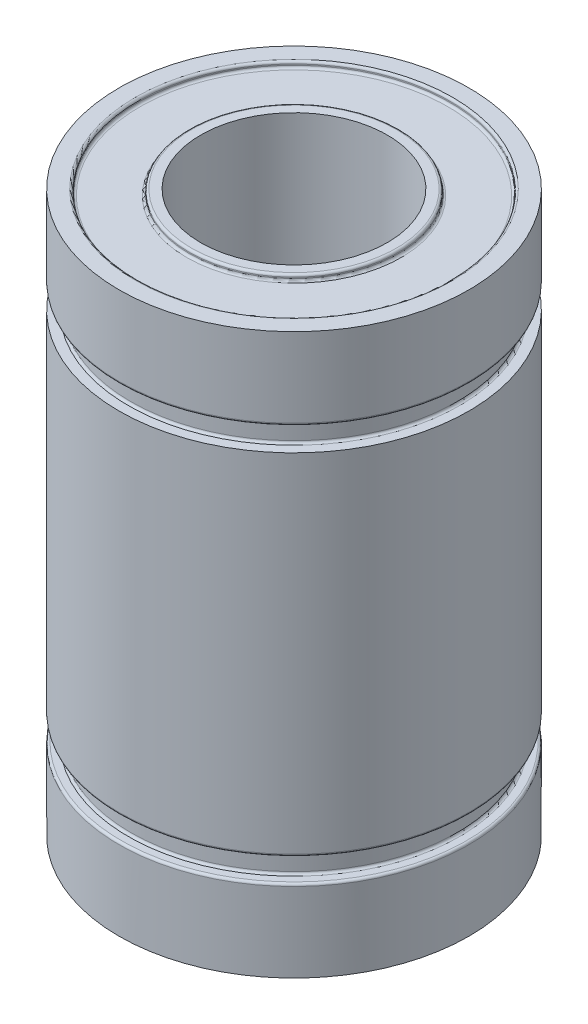
ISO-10303-21;
HEADER;
FILE_DESCRIPTION(('STEP AP214'),'2;1');
FILE_NAME('part.step','',(''),(''),'','','');
FILE_SCHEMA(('AUTOMOTIVE_DESIGN { 1 0 10303 214 1 1 1 1 }'));
ENDSEC;
DATA;
#1=APPLICATION_CONTEXT('core data for automotive mechanical design processes');
#2=APPLICATION_PROTOCOL_DEFINITION('international standard','automotive_design',2000,#1);
#3=PRODUCT_CONTEXT('',#1,'mechanical');
#4=PRODUCT('Part','Part','',(#3));
#5=PRODUCT_RELATED_PRODUCT_CATEGORY('part','',(#4));
#6=PRODUCT_DEFINITION_FORMATION('','',#4);
#7=PRODUCT_DEFINITION_CONTEXT('part definition',#1,'design');
#8=PRODUCT_DEFINITION('design','',#6,#7);
#9=PRODUCT_DEFINITION_SHAPE('','',#8);
#10=(LENGTH_UNIT() NAMED_UNIT(*) SI_UNIT(.MILLI.,.METRE.));
#11=(NAMED_UNIT(*) PLANE_ANGLE_UNIT() SI_UNIT($,.RADIAN.));
#12=(NAMED_UNIT(*) SI_UNIT($,.STERADIAN.) SOLID_ANGLE_UNIT());
#13=UNCERTAINTY_MEASURE_WITH_UNIT(LENGTH_MEASURE(1.E-05),#10,'distance_accuracy_value','');
#14=(GEOMETRIC_REPRESENTATION_CONTEXT(3) GLOBAL_UNCERTAINTY_ASSIGNED_CONTEXT((#13)) GLOBAL_UNIT_ASSIGNED_CONTEXT((#10,
#11,#12)) REPRESENTATION_CONTEXT('',''));
#15=CARTESIAN_POINT('',(0.,0.,0.));
#16=DIRECTION('',(0.,0.,1.));
#17=DIRECTION('',(1.,0.,0.));
#18=AXIS2_PLACEMENT_3D('',#15,#16,#17);
#19=CARTESIAN_POINT('',(0.,12.,0.));
#20=DIRECTION('',(0.,1.,0.));
#21=DIRECTION('',(0.,0.,1.));
#22=AXIS2_PLACEMENT_3D('',#19,#20,#21);
#23=PLANE('',#22);
#24=CARTESIAN_POINT('',(0.,12.,0.));
#25=DIRECTION('',(0.,1.,0.));
#26=DIRECTION('',(0.,0.,1.));
#27=AXIS2_PLACEMENT_3D('',#24,#25,#26);
#28=CIRCLE('',#27,4.4);
#29=CARTESIAN_POINT('',(0.,12.,4.4));
#30=VERTEX_POINT('',#29);
#31=EDGE_CURVE('E112',#30,#30,#28,.T.);
#32=ORIENTED_EDGE('',*,*,#31,.T.);
#33=EDGE_LOOP('',(#32));
#34=FACE_BOUND('',#33,.T.);
#35=CARTESIAN_POINT('',(0.,12.,0.));
#36=DIRECTION('',(0.,1.,0.));
#37=DIRECTION('',(0.,0.,1.));
#38=AXIS2_PLACEMENT_3D('',#35,#36,#37);
#39=CIRCLE('',#38,4.);
#40=CARTESIAN_POINT('',(0.,12.,4.));
#41=VERTEX_POINT('',#40);
#42=EDGE_CURVE('E134',#41,#41,#39,.T.);
#43=ORIENTED_EDGE('',*,*,#42,.F.);
#44=EDGE_LOOP('',(#43));
#45=FACE_BOUND('',#44,.T.);
#46=ADVANCED_FACE('F32',(#34,#45),#23,.T.);
#47=CARTESIAN_POINT('',(0.,-12.,0.));
#48=DIRECTION('',(0.,1.,0.));
#49=DIRECTION('',(0.,0.,1.));
#50=AXIS2_PLACEMENT_3D('',#47,#48,#49);
#51=PLANE('',#50);
#52=CARTESIAN_POINT('',(0.,-12.,0.));
#53=DIRECTION('',(0.,1.,0.));
#54=DIRECTION('',(0.,0.,1.));
#55=AXIS2_PLACEMENT_3D('',#52,#53,#54);
#56=CIRCLE('',#55,4.4);
#57=CARTESIAN_POINT('',(0.,-12.,4.4));
#58=VERTEX_POINT('',#57);
#59=EDGE_CURVE('E64',#58,#58,#56,.F.);
#60=ORIENTED_EDGE('',*,*,#59,.T.);
#61=EDGE_LOOP('',(#60));
#62=FACE_BOUND('',#61,.T.);
#63=CARTESIAN_POINT('',(0.,-12.,0.));
#64=DIRECTION('',(0.,1.,0.));
#65=DIRECTION('',(0.,0.,1.));
#66=AXIS2_PLACEMENT_3D('',#63,#64,#65);
#67=CIRCLE('',#66,4.);
#68=CARTESIAN_POINT('',(0.,-12.,4.));
#69=VERTEX_POINT('',#68);
#70=EDGE_CURVE('E137',#69,#69,#67,.T.);
#71=ORIENTED_EDGE('',*,*,#70,.T.);
#72=EDGE_LOOP('',(#71));
#73=FACE_BOUND('',#72,.T.);
#74=ADVANCED_FACE('F170',(#62,#73),#51,.F.);
#75=CARTESIAN_POINT('',(0.,12.,0.));
#76=DIRECTION('',(0.,-1.,0.));
#77=DIRECTION('',(0.,0.,-1.));
#78=AXIS2_PLACEMENT_3D('',#75,#76,#77);
#79=CYLINDRICAL_SURFACE('',#78,7.5);
#80=CARTESIAN_POINT('',(0.,-8.6,0.));
#81=DIRECTION('',(0.,-1.,0.));
#82=DIRECTION('',(0.,0.,-1.));
#83=AXIS2_PLACEMENT_3D('',#80,#81,#82);
#84=CIRCLE('',#83,7.5);
#85=CARTESIAN_POINT('',(0.,-8.6,-7.5));
#86=VERTEX_POINT('',#85);
#87=EDGE_CURVE('E10',#86,#86,#84,.T.);
#88=ORIENTED_EDGE('',*,*,#87,.T.);
#89=EDGE_LOOP('',(#88));
#90=FACE_BOUND('',#89,.T.);
#91=CARTESIAN_POINT('',(0.,-12.,0.));
#92=DIRECTION('',(0.,1.,0.));
#93=DIRECTION('',(0.,0.,1.));
#94=AXIS2_PLACEMENT_3D('',#91,#92,#93);
#95=CIRCLE('',#94,7.5);
#96=CARTESIAN_POINT('',(0.,-12.,7.5));
#97=VERTEX_POINT('',#96);
#98=EDGE_CURVE('E131',#97,#97,#95,.T.);
#99=ORIENTED_EDGE('',*,*,#98,.T.);
#100=EDGE_LOOP('',(#99));
#101=FACE_BOUND('',#100,.T.);
#102=ADVANCED_FACE('F154',(#90,#101),#79,.T.);
#103=CARTESIAN_POINT('',(0.,12.,0.));
#104=DIRECTION('',(0.,1.,0.));
#105=DIRECTION('',(0.,0.,1.));
#106=AXIS2_PLACEMENT_3D('',#103,#104,#105);
#107=CIRCLE('',#106,6.8);
#108=CARTESIAN_POINT('',(0.,12.,6.8));
#109=VERTEX_POINT('',#108);
#110=EDGE_CURVE('E97',#109,#109,#107,.F.);
#111=ORIENTED_EDGE('',*,*,#110,.T.);
#112=EDGE_LOOP('',(#111));
#113=FACE_BOUND('',#112,.T.);
#114=CARTESIAN_POINT('',(0.,12.,0.));
#115=DIRECTION('',(0.,1.,0.));
#116=DIRECTION('',(0.,0.,1.));
#117=AXIS2_PLACEMENT_3D('',#114,#115,#116);
#118=CIRCLE('',#117,7.5);
#119=CARTESIAN_POINT('',(0.,12.,7.5));
#120=VERTEX_POINT('',#119);
#121=EDGE_CURVE('E130',#120,#120,#118,.T.);
#122=ORIENTED_EDGE('',*,*,#121,.T.);
#123=EDGE_LOOP('',(#122));
#124=FACE_BOUND('',#123,.T.);
#125=ADVANCED_FACE('F169',(#113,#124),#23,.T.);
#126=CARTESIAN_POINT('',(0.,-12.,0.));
#127=DIRECTION('',(0.,1.,0.));
#128=DIRECTION('',(0.,0.,1.));
#129=AXIS2_PLACEMENT_3D('',#126,#127,#128);
#130=CIRCLE('',#129,6.8);
#131=CARTESIAN_POINT('',(0.,-12.,6.8));
#132=VERTEX_POINT('',#131);
#133=EDGE_CURVE('E79',#132,#132,#130,.T.);
#134=ORIENTED_EDGE('',*,*,#133,.T.);
#135=EDGE_LOOP('',(#134));
#136=FACE_BOUND('',#135,.T.);
#137=ORIENTED_EDGE('',*,*,#98,.F.);
#138=EDGE_LOOP('',(#137));
#139=FACE_BOUND('',#138,.T.);
#140=ADVANCED_FACE('F173',(#136,#139),#51,.F.);
#141=CARTESIAN_POINT('',(0.,8.6,0.));
#142=DIRECTION('',(0.,1.,0.));
#143=DIRECTION('',(0.,0.,1.));
#144=AXIS2_PLACEMENT_3D('',#141,#142,#143);
#145=CIRCLE('',#144,7.5);
#146=CARTESIAN_POINT('',(0.,8.6,7.5));
#147=VERTEX_POINT('',#146);
#148=EDGE_CURVE('E94',#147,#147,#145,.T.);
#149=ORIENTED_EDGE('',*,*,#148,.T.);
#150=EDGE_LOOP('',(#149));
#151=FACE_BOUND('',#150,.T.);
#152=ORIENTED_EDGE('',*,*,#121,.F.);
#153=EDGE_LOOP('',(#152));
#154=FACE_BOUND('',#153,.T.);
#155=ADVANCED_FACE('F155',(#151,#154),#79,.T.);
#156=CARTESIAN_POINT('',(0.,12.,0.));
#157=DIRECTION('',(0.,-1.,0.));
#158=DIRECTION('',(0.,0.,-1.));
#159=AXIS2_PLACEMENT_3D('',#156,#157,#158);
#160=CYLINDRICAL_SURFACE('',#159,4.);
#161=ORIENTED_EDGE('',*,*,#42,.T.);
#162=EDGE_LOOP('',(#161));
#163=FACE_BOUND('',#162,.T.);
#164=ORIENTED_EDGE('',*,*,#70,.F.);
#165=EDGE_LOOP('',(#164));
#166=FACE_BOUND('',#165,.T.);
#167=ADVANCED_FACE('F172',(#163,#166),#160,.F.);
#168=CARTESIAN_POINT('',(-7.5,-8.5,0.));
#169=DIRECTION('',(0.,-1.,0.));
#170=DIRECTION('',(0.,0.,-1.));
#171=AXIS2_PLACEMENT_3D('',#168,#169,#170);
#172=PLANE('',#171);
#173=CARTESIAN_POINT('',(0.,-8.5,0.));
#174=DIRECTION('',(0.,-1.,0.));
#175=DIRECTION('',(0.,0.,-1.));
#176=AXIS2_PLACEMENT_3D('',#173,#174,#175);
#177=CIRCLE('',#176,7.4);
#178=CARTESIAN_POINT('',(0.,-8.5,-7.4));
#179=VERTEX_POINT('',#178);
#180=EDGE_CURVE('E39',#179,#179,#177,.F.);
#181=ORIENTED_EDGE('',*,*,#180,.T.);
#182=EDGE_LOOP('',(#181));
#183=FACE_BOUND('',#182,.T.);
#184=CARTESIAN_POINT('',(0.,-8.5,0.));
#185=DIRECTION('',(0.,-1.,0.));
#186=DIRECTION('',(0.,0.,-1.));
#187=AXIS2_PLACEMENT_3D('',#184,#185,#186);
#188=CIRCLE('',#187,7.1);
#189=CARTESIAN_POINT('',(0.,-8.5,-7.1));
#190=VERTEX_POINT('',#189);
#191=EDGE_CURVE('E43',#190,#190,#188,.T.);
#192=ORIENTED_EDGE('',*,*,#191,.T.);
#193=EDGE_LOOP('',(#192));
#194=FACE_BOUND('',#193,.T.);
#195=ADVANCED_FACE('F257',(#183,#194),#172,.F.);
#196=CARTESIAN_POINT('',(0.,12.,0.));
#197=DIRECTION('',(0.,1.,0.));
#198=DIRECTION('',(0.,0.,1.));
#199=AXIS2_PLACEMENT_3D('',#196,#197,#198);
#200=CYLINDRICAL_SURFACE('',#199,7.);
#201=CARTESIAN_POINT('',(0.,-7.6,0.));
#202=DIRECTION('',(0.,1.,0.));
#203=DIRECTION('',(0.,0.,1.));
#204=AXIS2_PLACEMENT_3D('',#201,#202,#203);
#205=CIRCLE('',#204,7.);
#206=CARTESIAN_POINT('',(0.,-7.6,7.));
#207=VERTEX_POINT('',#206);
#208=EDGE_CURVE('E47',#207,#207,#205,.F.);
#209=ORIENTED_EDGE('',*,*,#208,.T.);
#210=EDGE_LOOP('',(#209));
#211=FACE_BOUND('',#210,.T.);
#212=CARTESIAN_POINT('',(0.,-8.4,0.));
#213=DIRECTION('',(0.,-1.,0.));
#214=DIRECTION('',(0.,0.,-1.));
#215=AXIS2_PLACEMENT_3D('',#212,#213,#214);
#216=CIRCLE('',#215,7.);
#217=CARTESIAN_POINT('',(0.,-8.4,-7.));
#218=VERTEX_POINT('',#217);
#219=EDGE_CURVE('E52',#218,#218,#216,.F.);
#220=ORIENTED_EDGE('',*,*,#219,.T.);
#221=EDGE_LOOP('',(#220));
#222=FACE_BOUND('',#221,.T.);
#223=ADVANCED_FACE('F254',(#211,#222),#200,.T.);
#224=CARTESIAN_POINT('',(-7.5,-7.5,0.));
#225=DIRECTION('',(0.,1.,0.));
#226=DIRECTION('',(0.,0.,1.));
#227=AXIS2_PLACEMENT_3D('',#224,#225,#226);
#228=PLANE('',#227);
#229=CARTESIAN_POINT('',(0.,-7.5,0.));
#230=DIRECTION('',(0.,1.,0.));
#231=DIRECTION('',(0.,0.,1.));
#232=AXIS2_PLACEMENT_3D('',#229,#230,#231);
#233=CIRCLE('',#232,7.4);
#234=CARTESIAN_POINT('',(0.,-7.5,7.4));
#235=VERTEX_POINT('',#234);
#236=EDGE_CURVE('E55',#235,#235,#233,.F.);
#237=ORIENTED_EDGE('',*,*,#236,.T.);
#238=EDGE_LOOP('',(#237));
#239=FACE_BOUND('',#238,.T.);
#240=CARTESIAN_POINT('',(0.,-7.5,0.));
#241=DIRECTION('',(0.,1.,0.));
#242=DIRECTION('',(0.,0.,1.));
#243=AXIS2_PLACEMENT_3D('',#240,#241,#242);
#244=CIRCLE('',#243,7.1);
#245=CARTESIAN_POINT('',(0.,-7.5,7.1));
#246=VERTEX_POINT('',#245);
#247=EDGE_CURVE('E58',#246,#246,#244,.T.);
#248=ORIENTED_EDGE('',*,*,#247,.T.);
#249=EDGE_LOOP('',(#248));
#250=FACE_BOUND('',#249,.T.);
#251=ADVANCED_FACE('F256',(#239,#250),#228,.F.);
#252=CARTESIAN_POINT('',(-7.5,7.5,0.));
#253=DIRECTION('',(0.,-1.,0.));
#254=DIRECTION('',(0.,0.,-1.));
#255=AXIS2_PLACEMENT_3D('',#252,#253,#254);
#256=PLANE('',#255);
#257=CARTESIAN_POINT('',(0.,7.5,0.));
#258=DIRECTION('',(0.,-1.,0.));
#259=DIRECTION('',(0.,0.,-1.));
#260=AXIS2_PLACEMENT_3D('',#257,#258,#259);
#261=CIRCLE('',#260,7.1);
#262=CARTESIAN_POINT('',(0.,7.5,-7.1));
#263=VERTEX_POINT('',#262);
#264=EDGE_CURVE('E121',#263,#263,#261,.T.);
#265=ORIENTED_EDGE('',*,*,#264,.T.);
#266=EDGE_LOOP('',(#265));
#267=FACE_BOUND('',#266,.T.);
#268=CARTESIAN_POINT('',(0.,7.5,0.));
#269=DIRECTION('',(0.,1.,0.));
#270=DIRECTION('',(0.,0.,1.));
#271=AXIS2_PLACEMENT_3D('',#268,#269,#270);
#272=CIRCLE('',#271,7.5);
#273=CARTESIAN_POINT('',(0.,7.5,7.5));
#274=VERTEX_POINT('',#273);
#275=EDGE_CURVE('E140',#274,#274,#272,.T.);
#276=ORIENTED_EDGE('',*,*,#275,.T.);
#277=EDGE_LOOP('',(#276));
#278=FACE_BOUND('',#277,.T.);
#279=ADVANCED_FACE('F146',(#267,#278),#256,.F.);
#280=CARTESIAN_POINT('',(0.,12.,0.));
#281=DIRECTION('',(0.,1.,0.));
#282=DIRECTION('',(0.,0.,1.));
#283=AXIS2_PLACEMENT_3D('',#280,#281,#282);
#284=CYLINDRICAL_SURFACE('',#283,7.);
#285=CARTESIAN_POINT('',(0.,7.6,0.));
#286=DIRECTION('',(0.,-1.,0.));
#287=DIRECTION('',(0.,0.,-1.));
#288=AXIS2_PLACEMENT_3D('',#285,#286,#287);
#289=CIRCLE('',#288,7.);
#290=CARTESIAN_POINT('',(0.,7.6,-7.));
#291=VERTEX_POINT('',#290);
#292=EDGE_CURVE('E124',#291,#291,#289,.F.);
#293=ORIENTED_EDGE('',*,*,#292,.T.);
#294=EDGE_LOOP('',(#293));
#295=FACE_BOUND('',#294,.T.);
#296=CARTESIAN_POINT('',(0.,8.4,0.));
#297=DIRECTION('',(0.,1.,0.));
#298=DIRECTION('',(0.,0.,1.));
#299=AXIS2_PLACEMENT_3D('',#296,#297,#298);
#300=CIRCLE('',#299,7.);
#301=CARTESIAN_POINT('',(0.,8.4,7.));
#302=VERTEX_POINT('',#301);
#303=EDGE_CURVE('E127',#302,#302,#300,.F.);
#304=ORIENTED_EDGE('',*,*,#303,.T.);
#305=EDGE_LOOP('',(#304));
#306=FACE_BOUND('',#305,.T.);
#307=ADVANCED_FACE('F163',(#295,#306),#284,.T.);
#308=CARTESIAN_POINT('',(-7.5,8.5,0.));
#309=DIRECTION('',(0.,1.,0.));
#310=DIRECTION('',(0.,0.,1.));
#311=AXIS2_PLACEMENT_3D('',#308,#309,#310);
#312=PLANE('',#311);
#313=CARTESIAN_POINT('',(0.,8.5,0.));
#314=DIRECTION('',(0.,1.,0.));
#315=DIRECTION('',(0.,0.,1.));
#316=AXIS2_PLACEMENT_3D('',#313,#314,#315);
#317=CIRCLE('',#316,7.4);
#318=CARTESIAN_POINT('',(0.,8.5,7.4));
#319=VERTEX_POINT('',#318);
#320=EDGE_CURVE('E88',#319,#319,#317,.F.);
#321=ORIENTED_EDGE('',*,*,#320,.T.);
#322=EDGE_LOOP('',(#321));
#323=FACE_BOUND('',#322,.T.);
#324=CARTESIAN_POINT('',(0.,8.5,0.));
#325=DIRECTION('',(0.,1.,0.));
#326=DIRECTION('',(0.,0.,1.));
#327=AXIS2_PLACEMENT_3D('',#324,#325,#326);
#328=CIRCLE('',#327,7.1);
#329=CARTESIAN_POINT('',(0.,8.5,7.1));
#330=VERTEX_POINT('',#329);
#331=EDGE_CURVE('E91',#330,#330,#328,.T.);
#332=ORIENTED_EDGE('',*,*,#331,.T.);
#333=EDGE_LOOP('',(#332));
#334=FACE_BOUND('',#333,.T.);
#335=ADVANCED_FACE('F151',(#323,#334),#312,.F.);
#336=CARTESIAN_POINT('',(0.,-7.4,0.));
#337=DIRECTION('',(0.,1.,0.));
#338=DIRECTION('',(0.,0.,1.));
#339=AXIS2_PLACEMENT_3D('',#336,#337,#338);
#340=CIRCLE('',#339,7.5);
#341=CARTESIAN_POINT('',(0.,-7.4,7.5));
#342=VERTEX_POINT('',#341);
#343=EDGE_CURVE('E61',#342,#342,#340,.T.);
#344=ORIENTED_EDGE('',*,*,#343,.T.);
#345=EDGE_LOOP('',(#344));
#346=FACE_BOUND('',#345,.T.);
#347=ORIENTED_EDGE('',*,*,#275,.F.);
#348=EDGE_LOOP('',(#347));
#349=FACE_BOUND('',#348,.T.);
#350=ADVANCED_FACE('F148',(#346,#349),#79,.T.);
#351=CARTESIAN_POINT('',(0.,-11.75,0.));
#352=DIRECTION('',(0.,-1.,0.));
#353=DIRECTION('',(0.,0.,-1.));
#354=AXIS2_PLACEMENT_3D('',#351,#352,#353);
#355=CYLINDRICAL_SURFACE('',#354,6.7);
#356=CARTESIAN_POINT('',(0.,-11.9,0.));
#357=DIRECTION('',(0.,1.,0.));
#358=DIRECTION('',(0.,0.,1.));
#359=AXIS2_PLACEMENT_3D('',#356,#357,#358);
#360=CIRCLE('',#359,6.7);
#361=CARTESIAN_POINT('',(0.,-11.9,6.7));
#362=VERTEX_POINT('',#361);
#363=EDGE_CURVE('E82',#362,#362,#360,.F.);
#364=ORIENTED_EDGE('',*,*,#363,.T.);
#365=EDGE_LOOP('',(#364));
#366=FACE_BOUND('',#365,.T.);
#367=CARTESIAN_POINT('',(0.,-11.85,0.));
#368=DIRECTION('',(0.,-1.,0.));
#369=DIRECTION('',(0.,0.,-1.));
#370=AXIS2_PLACEMENT_3D('',#367,#368,#369);
#371=CIRCLE('',#370,6.7);
#372=CARTESIAN_POINT('',(0.,-11.85,-6.7));
#373=VERTEX_POINT('',#372);
#374=EDGE_CURVE('E85',#373,#373,#371,.F.);
#375=ORIENTED_EDGE('',*,*,#374,.T.);
#376=EDGE_LOOP('',(#375));
#377=FACE_BOUND('',#376,.T.);
#378=ADVANCED_FACE('F150',(#366,#377),#355,.F.);
#379=CARTESIAN_POINT('',(0.,-11.75,0.));
#380=DIRECTION('',(0.,-1.,0.));
#381=DIRECTION('',(0.,0.,-1.));
#382=AXIS2_PLACEMENT_3D('',#379,#380,#381);
#383=PLANE('',#382);
#384=CARTESIAN_POINT('',(0.,-11.75,0.));
#385=DIRECTION('',(0.,-1.,0.));
#386=DIRECTION('',(0.,0.,-1.));
#387=AXIS2_PLACEMENT_3D('',#384,#385,#386);
#388=CIRCLE('',#387,6.6);
#389=CARTESIAN_POINT('',(0.,-11.75,-6.6));
#390=VERTEX_POINT('',#389);
#391=EDGE_CURVE('E73',#390,#390,#388,.T.);
#392=ORIENTED_EDGE('',*,*,#391,.T.);
#393=EDGE_LOOP('',(#392));
#394=FACE_BOUND('',#393,.T.);
#395=CARTESIAN_POINT('',(0.,-11.75,0.));
#396=DIRECTION('',(0.,-1.,0.));
#397=DIRECTION('',(0.,0.,-1.));
#398=AXIS2_PLACEMENT_3D('',#395,#396,#397);
#399=CIRCLE('',#398,4.6);
#400=CARTESIAN_POINT('',(0.,-11.75,-4.6));
#401=VERTEX_POINT('',#400);
#402=EDGE_CURVE('E76',#401,#401,#399,.F.);
#403=ORIENTED_EDGE('',*,*,#402,.T.);
#404=EDGE_LOOP('',(#403));
#405=FACE_BOUND('',#404,.T.);
#406=ADVANCED_FACE('F160',(#394,#405),#383,.T.);
#407=CARTESIAN_POINT('',(0.,-11.75,0.));
#408=DIRECTION('',(0.,-1.,0.));
#409=DIRECTION('',(0.,0.,-1.));
#410=AXIS2_PLACEMENT_3D('',#407,#408,#409);
#411=CYLINDRICAL_SURFACE('',#410,4.5);
#412=CARTESIAN_POINT('',(0.,-11.85,0.));
#413=DIRECTION('',(0.,-1.,0.));
#414=DIRECTION('',(0.,0.,-1.));
#415=AXIS2_PLACEMENT_3D('',#412,#413,#414);
#416=CIRCLE('',#415,4.5);
#417=CARTESIAN_POINT('',(0.,-11.85,-4.5));
#418=VERTEX_POINT('',#417);
#419=EDGE_CURVE('E67',#418,#418,#416,.T.);
#420=ORIENTED_EDGE('',*,*,#419,.T.);
#421=EDGE_LOOP('',(#420));
#422=FACE_BOUND('',#421,.T.);
#423=CARTESIAN_POINT('',(0.,-11.9,0.));
#424=DIRECTION('',(0.,1.,0.));
#425=DIRECTION('',(0.,0.,1.));
#426=AXIS2_PLACEMENT_3D('',#423,#424,#425);
#427=CIRCLE('',#426,4.5);
#428=CARTESIAN_POINT('',(0.,-11.9,4.5));
#429=VERTEX_POINT('',#428);
#430=EDGE_CURVE('E70',#429,#429,#427,.T.);
#431=ORIENTED_EDGE('',*,*,#430,.T.);
#432=EDGE_LOOP('',(#431));
#433=FACE_BOUND('',#432,.T.);
#434=ADVANCED_FACE('F346',(#422,#433),#411,.T.);
#435=CARTESIAN_POINT('',(0.,11.75,0.));
#436=DIRECTION('',(0.,1.,0.));
#437=DIRECTION('',(0.,0.,-1.));
#438=AXIS2_PLACEMENT_3D('',#435,#436,#437);
#439=PLANE('',#438);
#440=CARTESIAN_POINT('',(0.,11.75,0.));
#441=DIRECTION('',(0.,1.,0.));
#442=DIRECTION('',(0.,0.,1.));
#443=AXIS2_PLACEMENT_3D('',#440,#441,#442);
#444=CIRCLE('',#443,4.6);
#445=CARTESIAN_POINT('',(0.,11.75,4.6));
#446=VERTEX_POINT('',#445);
#447=EDGE_CURVE('E106',#446,#446,#444,.F.);
#448=ORIENTED_EDGE('',*,*,#447,.T.);
#449=EDGE_LOOP('',(#448));
#450=FACE_BOUND('',#449,.T.);
#451=CARTESIAN_POINT('',(0.,11.75,0.));
#452=DIRECTION('',(0.,1.,0.));
#453=DIRECTION('',(0.,0.,1.));
#454=AXIS2_PLACEMENT_3D('',#451,#452,#453);
#455=CIRCLE('',#454,6.6);
#456=CARTESIAN_POINT('',(0.,11.75,6.6));
#457=VERTEX_POINT('',#456);
#458=EDGE_CURVE('E109',#457,#457,#455,.T.);
#459=ORIENTED_EDGE('',*,*,#458,.T.);
#460=EDGE_LOOP('',(#459));
#461=FACE_BOUND('',#460,.T.);
#462=ADVANCED_FACE('F357',(#450,#461),#439,.T.);
#463=CARTESIAN_POINT('',(0.,11.75,0.));
#464=DIRECTION('',(0.,1.,0.));
#465=DIRECTION('',(0.,0.,1.));
#466=AXIS2_PLACEMENT_3D('',#463,#464,#465);
#467=CYLINDRICAL_SURFACE('',#466,6.7);
#468=CARTESIAN_POINT('',(0.,11.85,0.));
#469=DIRECTION('',(0.,1.,0.));
#470=DIRECTION('',(0.,0.,1.));
#471=AXIS2_PLACEMENT_3D('',#468,#469,#470);
#472=CIRCLE('',#471,6.7);
#473=CARTESIAN_POINT('',(0.,11.85,6.7));
#474=VERTEX_POINT('',#473);
#475=EDGE_CURVE('E100',#474,#474,#472,.F.);
#476=ORIENTED_EDGE('',*,*,#475,.T.);
#477=EDGE_LOOP('',(#476));
#478=FACE_BOUND('',#477,.T.);
#479=CARTESIAN_POINT('',(0.,11.9,0.));
#480=DIRECTION('',(0.,1.,0.));
#481=DIRECTION('',(0.,0.,1.));
#482=AXIS2_PLACEMENT_3D('',#479,#480,#481);
#483=CIRCLE('',#482,6.7);
#484=CARTESIAN_POINT('',(0.,11.9,6.7));
#485=VERTEX_POINT('',#484);
#486=EDGE_CURVE('E103',#485,#485,#483,.T.);
#487=ORIENTED_EDGE('',*,*,#486,.T.);
#488=EDGE_LOOP('',(#487));
#489=FACE_BOUND('',#488,.T.);
#490=ADVANCED_FACE('F369',(#478,#489),#467,.F.);
#491=CARTESIAN_POINT('',(0.,11.75,0.));
#492=DIRECTION('',(0.,1.,0.));
#493=DIRECTION('',(0.,0.,1.));
#494=AXIS2_PLACEMENT_3D('',#491,#492,#493);
#495=CYLINDRICAL_SURFACE('',#494,4.5);
#496=CARTESIAN_POINT('',(0.,11.9,0.));
#497=DIRECTION('',(0.,1.,0.));
#498=DIRECTION('',(0.,0.,1.));
#499=AXIS2_PLACEMENT_3D('',#496,#497,#498);
#500=CIRCLE('',#499,4.5);
#501=CARTESIAN_POINT('',(0.,11.9,4.5));
#502=VERTEX_POINT('',#501);
#503=EDGE_CURVE('E115',#502,#502,#500,.F.);
#504=ORIENTED_EDGE('',*,*,#503,.T.);
#505=EDGE_LOOP('',(#504));
#506=FACE_BOUND('',#505,.T.);
#507=CARTESIAN_POINT('',(0.,11.85,0.));
#508=DIRECTION('',(0.,1.,0.));
#509=DIRECTION('',(0.,0.,1.));
#510=AXIS2_PLACEMENT_3D('',#507,#508,#509);
#511=CIRCLE('',#510,4.5);
#512=CARTESIAN_POINT('',(0.,11.85,4.5));
#513=VERTEX_POINT('',#512);
#514=EDGE_CURVE('E118',#513,#513,#511,.T.);
#515=ORIENTED_EDGE('',*,*,#514,.T.);
#516=EDGE_LOOP('',(#515));
#517=FACE_BOUND('',#516,.T.);
#518=ADVANCED_FACE('F380',(#506,#517),#495,.T.);
#519=CARTESIAN_POINT('',(0.,7.6,0.));
#520=DIRECTION('',(0.,-1.,0.));
#521=DIRECTION('',(0.,0.,-1.));
#522=AXIS2_PLACEMENT_3D('',#519,#520,#521);
#523=TOROIDAL_SURFACE('',#522,7.1,0.1);
#524=ORIENTED_EDGE('',*,*,#264,.F.);
#525=EDGE_LOOP('',(#524));
#526=FACE_BOUND('',#525,.T.);
#527=ORIENTED_EDGE('',*,*,#292,.F.);
#528=EDGE_LOOP('',(#527));
#529=FACE_BOUND('',#528,.T.);
#530=ADVANCED_FACE('F390',(#526,#529),#523,.F.);
#531=CARTESIAN_POINT('',(0.,11.9,0.));
#532=DIRECTION('',(0.,1.,0.));
#533=DIRECTION('',(0.,0.,1.));
#534=AXIS2_PLACEMENT_3D('',#531,#532,#533);
#535=TOROIDAL_SURFACE('',#534,4.4,0.1);
#536=ORIENTED_EDGE('',*,*,#31,.F.);
#537=EDGE_LOOP('',(#536));
#538=FACE_BOUND('',#537,.T.);
#539=ORIENTED_EDGE('',*,*,#503,.F.);
#540=EDGE_LOOP('',(#539));
#541=FACE_BOUND('',#540,.T.);
#542=ADVANCED_FACE('F400',(#538,#541),#535,.T.);
#543=CARTESIAN_POINT('',(0.,11.85,0.));
#544=DIRECTION('',(0.,1.,0.));
#545=DIRECTION('',(0.,0.,1.));
#546=AXIS2_PLACEMENT_3D('',#543,#544,#545);
#547=TOROIDAL_SURFACE('',#546,4.6,0.1);
#548=ORIENTED_EDGE('',*,*,#514,.F.);
#549=EDGE_LOOP('',(#548));
#550=FACE_BOUND('',#549,.T.);
#551=ORIENTED_EDGE('',*,*,#447,.F.);
#552=EDGE_LOOP('',(#551));
#553=FACE_BOUND('',#552,.T.);
#554=ADVANCED_FACE('F208',(#550,#553),#547,.F.);
#555=CARTESIAN_POINT('',(0.,11.85,0.));
#556=DIRECTION('',(0.,1.,0.));
#557=DIRECTION('',(0.,0.,1.));
#558=AXIS2_PLACEMENT_3D('',#555,#556,#557);
#559=TOROIDAL_SURFACE('',#558,6.6,0.1);
#560=ORIENTED_EDGE('',*,*,#458,.F.);
#561=EDGE_LOOP('',(#560));
#562=FACE_BOUND('',#561,.T.);
#563=ORIENTED_EDGE('',*,*,#475,.F.);
#564=EDGE_LOOP('',(#563));
#565=FACE_BOUND('',#564,.T.);
#566=ADVANCED_FACE('F198',(#562,#565),#559,.F.);
#567=CARTESIAN_POINT('',(0.,11.9,0.));
#568=DIRECTION('',(0.,1.,0.));
#569=DIRECTION('',(0.,0.,1.));
#570=AXIS2_PLACEMENT_3D('',#567,#568,#569);
#571=TOROIDAL_SURFACE('',#570,6.8,0.1);
#572=ORIENTED_EDGE('',*,*,#486,.F.);
#573=EDGE_LOOP('',(#572));
#574=FACE_BOUND('',#573,.T.);
#575=ORIENTED_EDGE('',*,*,#110,.F.);
#576=EDGE_LOOP('',(#575));
#577=FACE_BOUND('',#576,.T.);
#578=ADVANCED_FACE('F195',(#574,#577),#571,.T.);
#579=CARTESIAN_POINT('',(0.,8.6,0.));
#580=DIRECTION('',(0.,1.,0.));
#581=DIRECTION('',(0.,0.,1.));
#582=AXIS2_PLACEMENT_3D('',#579,#580,#581);
#583=TOROIDAL_SURFACE('',#582,7.4,0.1);
#584=ORIENTED_EDGE('',*,*,#320,.F.);
#585=EDGE_LOOP('',(#584));
#586=FACE_BOUND('',#585,.T.);
#587=ORIENTED_EDGE('',*,*,#148,.F.);
#588=EDGE_LOOP('',(#587));
#589=FACE_BOUND('',#588,.T.);
#590=ADVANCED_FACE('F197',(#586,#589),#583,.T.);
#591=CARTESIAN_POINT('',(0.,8.4,0.));
#592=DIRECTION('',(0.,1.,0.));
#593=DIRECTION('',(0.,0.,1.));
#594=AXIS2_PLACEMENT_3D('',#591,#592,#593);
#595=TOROIDAL_SURFACE('',#594,7.1,0.1);
#596=ORIENTED_EDGE('',*,*,#303,.F.);
#597=EDGE_LOOP('',(#596));
#598=FACE_BOUND('',#597,.T.);
#599=ORIENTED_EDGE('',*,*,#331,.F.);
#600=EDGE_LOOP('',(#599));
#601=FACE_BOUND('',#600,.T.);
#602=ADVANCED_FACE('F205',(#598,#601),#595,.F.);
#603=CARTESIAN_POINT('',(0.,-11.9,0.));
#604=DIRECTION('',(0.,1.,0.));
#605=DIRECTION('',(0.,0.,1.));
#606=AXIS2_PLACEMENT_3D('',#603,#604,#605);
#607=TOROIDAL_SURFACE('',#606,6.8,0.1);
#608=ORIENTED_EDGE('',*,*,#133,.F.);
#609=EDGE_LOOP('',(#608));
#610=FACE_BOUND('',#609,.T.);
#611=ORIENTED_EDGE('',*,*,#363,.F.);
#612=EDGE_LOOP('',(#611));
#613=FACE_BOUND('',#612,.T.);
#614=ADVANCED_FACE('F216',(#610,#613),#607,.T.);
#615=CARTESIAN_POINT('',(0.,-11.85,0.));
#616=DIRECTION('',(0.,-1.,0.));
#617=DIRECTION('',(0.,0.,-1.));
#618=AXIS2_PLACEMENT_3D('',#615,#616,#617);
#619=TOROIDAL_SURFACE('',#618,6.6,0.1);
#620=ORIENTED_EDGE('',*,*,#374,.F.);
#621=EDGE_LOOP('',(#620));
#622=FACE_BOUND('',#621,.T.);
#623=ORIENTED_EDGE('',*,*,#391,.F.);
#624=EDGE_LOOP('',(#623));
#625=FACE_BOUND('',#624,.T.);
#626=ADVANCED_FACE('F220',(#622,#625),#619,.F.);
#627=CARTESIAN_POINT('',(0.,-11.85,0.));
#628=DIRECTION('',(0.,-1.,0.));
#629=DIRECTION('',(0.,0.,-1.));
#630=AXIS2_PLACEMENT_3D('',#627,#628,#629);
#631=TOROIDAL_SURFACE('',#630,4.6,0.1);
#632=ORIENTED_EDGE('',*,*,#402,.F.);
#633=EDGE_LOOP('',(#632));
#634=FACE_BOUND('',#633,.T.);
#635=ORIENTED_EDGE('',*,*,#419,.F.);
#636=EDGE_LOOP('',(#635));
#637=FACE_BOUND('',#636,.T.);
#638=ADVANCED_FACE('F224',(#634,#637),#631,.F.);
#639=CARTESIAN_POINT('',(0.,-11.9,0.));
#640=DIRECTION('',(0.,1.,0.));
#641=DIRECTION('',(0.,0.,1.));
#642=AXIS2_PLACEMENT_3D('',#639,#640,#641);
#643=TOROIDAL_SURFACE('',#642,4.4,0.1);
#644=ORIENTED_EDGE('',*,*,#430,.F.);
#645=EDGE_LOOP('',(#644));
#646=FACE_BOUND('',#645,.T.);
#647=ORIENTED_EDGE('',*,*,#59,.F.);
#648=EDGE_LOOP('',(#647));
#649=FACE_BOUND('',#648,.T.);
#650=ADVANCED_FACE('F228',(#646,#649),#643,.T.);
#651=CARTESIAN_POINT('',(0.,-7.4,0.));
#652=DIRECTION('',(0.,1.,0.));
#653=DIRECTION('',(0.,0.,1.));
#654=AXIS2_PLACEMENT_3D('',#651,#652,#653);
#655=TOROIDAL_SURFACE('',#654,7.4,0.1);
#656=ORIENTED_EDGE('',*,*,#236,.F.);
#657=EDGE_LOOP('',(#656));
#658=FACE_BOUND('',#657,.T.);
#659=ORIENTED_EDGE('',*,*,#343,.F.);
#660=EDGE_LOOP('',(#659));
#661=FACE_BOUND('',#660,.T.);
#662=ADVANCED_FACE('F232',(#658,#661),#655,.T.);
#663=CARTESIAN_POINT('',(0.,-7.6,0.));
#664=DIRECTION('',(0.,1.,0.));
#665=DIRECTION('',(0.,0.,1.));
#666=AXIS2_PLACEMENT_3D('',#663,#664,#665);
#667=TOROIDAL_SURFACE('',#666,7.1,0.1);
#668=ORIENTED_EDGE('',*,*,#208,.F.);
#669=EDGE_LOOP('',(#668));
#670=FACE_BOUND('',#669,.T.);
#671=ORIENTED_EDGE('',*,*,#247,.F.);
#672=EDGE_LOOP('',(#671));
#673=FACE_BOUND('',#672,.T.);
#674=ADVANCED_FACE('F236',(#670,#673),#667,.F.);
#675=CARTESIAN_POINT('',(0.,-8.6,0.));
#676=DIRECTION('',(0.,-1.,0.));
#677=DIRECTION('',(0.,0.,-1.));
#678=AXIS2_PLACEMENT_3D('',#675,#676,#677);
#679=TOROIDAL_SURFACE('',#678,7.4,0.1);
#680=ORIENTED_EDGE('',*,*,#87,.F.);
#681=EDGE_LOOP('',(#680));
#682=FACE_BOUND('',#681,.T.);
#683=ORIENTED_EDGE('',*,*,#180,.F.);
#684=EDGE_LOOP('',(#683));
#685=FACE_BOUND('',#684,.T.);
#686=ADVANCED_FACE('F239',(#682,#685),#679,.T.);
#687=CARTESIAN_POINT('',(0.,-8.4,0.));
#688=DIRECTION('',(0.,-1.,0.));
#689=DIRECTION('',(0.,0.,-1.));
#690=AXIS2_PLACEMENT_3D('',#687,#688,#689);
#691=TOROIDAL_SURFACE('',#690,7.1,0.1);
#692=ORIENTED_EDGE('',*,*,#191,.F.);
#693=EDGE_LOOP('',(#692));
#694=FACE_BOUND('',#693,.T.);
#695=ORIENTED_EDGE('',*,*,#219,.F.);
#696=EDGE_LOOP('',(#695));
#697=FACE_BOUND('',#696,.T.);
#698=ADVANCED_FACE('F34',(#694,#697),#691,.F.);
#699=CLOSED_SHELL('',(#46,#74,#102,#125,#140,#155,#167,#195,#223,#251,#279,#307,#335,#350,#378,
#406,#434,#462,#490,#518,#530,#542,#554,#566,#578,#590,#602,#614,#626,#638,#650,#662,#674,#686,#698));
#700=MANIFOLD_SOLID_BREP('B2',#699);
#701=ADVANCED_BREP_SHAPE_REPRESENTATION('',(#18,#700),#14);
#702=SHAPE_DEFINITION_REPRESENTATION(#9,#701);
ENDSEC;
END-ISO-10303-21;
